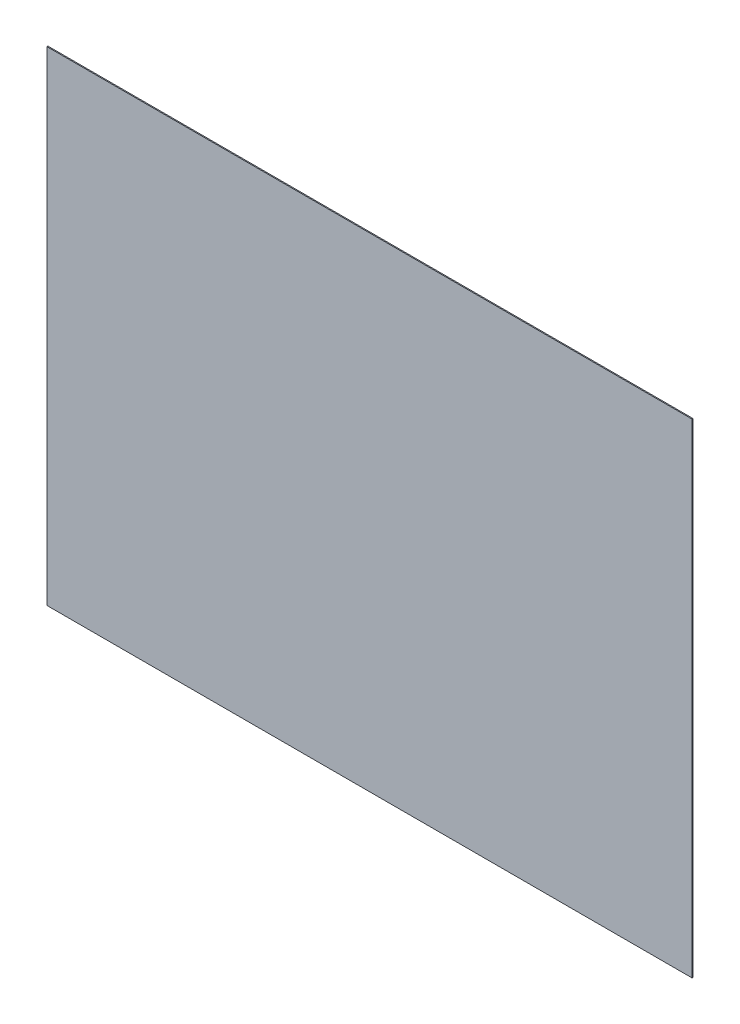
ISO-10303-21;
HEADER;
FILE_DESCRIPTION(('STEP AP214'),'2;1');
FILE_NAME('part.step','',(''),(''),'','','');
FILE_SCHEMA(('AUTOMOTIVE_DESIGN { 1 0 10303 214 1 1 1 1 }'));
ENDSEC;
DATA;
#1=APPLICATION_CONTEXT('core data for automotive mechanical design processes');
#2=APPLICATION_PROTOCOL_DEFINITION('international standard','automotive_design',2000,#1);
#3=PRODUCT_CONTEXT('',#1,'mechanical');
#4=PRODUCT('Part','Part','',(#3));
#5=PRODUCT_RELATED_PRODUCT_CATEGORY('part','',(#4));
#6=PRODUCT_DEFINITION_FORMATION('','',#4);
#7=PRODUCT_DEFINITION_CONTEXT('part definition',#1,'design');
#8=PRODUCT_DEFINITION('design','',#6,#7);
#9=PRODUCT_DEFINITION_SHAPE('','',#8);
#10=(LENGTH_UNIT() NAMED_UNIT(*) SI_UNIT(.MILLI.,.METRE.));
#11=(NAMED_UNIT(*) PLANE_ANGLE_UNIT() SI_UNIT($,.RADIAN.));
#12=(NAMED_UNIT(*) SI_UNIT($,.STERADIAN.) SOLID_ANGLE_UNIT());
#13=UNCERTAINTY_MEASURE_WITH_UNIT(LENGTH_MEASURE(1.E-05),#10,'distance_accuracy_value','');
#14=(GEOMETRIC_REPRESENTATION_CONTEXT(3) GLOBAL_UNCERTAINTY_ASSIGNED_CONTEXT((#13)) GLOBAL_UNIT_ASSIGNED_CONTEXT((#10,
#11,#12)) REPRESENTATION_CONTEXT('',''));
#15=CARTESIAN_POINT('',(0.,0.,0.));
#16=DIRECTION('',(0.,0.,1.));
#17=DIRECTION('',(1.,0.,0.));
#18=AXIS2_PLACEMENT_3D('',#15,#16,#17);
#19=CARTESIAN_POINT('',(32.4,-24.3,0.));
#20=DIRECTION('',(0.,0.,-1.));
#21=DIRECTION('',(-1.,0.,0.));
#22=AXIS2_PLACEMENT_3D('',#19,#20,#21);
#23=PLANE('',#22);
#24=DIRECTION('',(0.,1.,0.));
#25=VECTOR('',#24,1.);
#26=CARTESIAN_POINT('',(-32.4,24.3,0.));
#27=LINE('',#26,#25);
#28=CARTESIAN_POINT('',(-32.4,-24.3,0.));
#29=VERTEX_POINT('',#28);
#30=CARTESIAN_POINT('',(-32.4,24.3,0.));
#31=VERTEX_POINT('',#30);
#32=EDGE_CURVE('E54',#29,#31,#27,.T.);
#33=ORIENTED_EDGE('',*,*,#32,.T.);
#34=DIRECTION('',(1.,0.,0.));
#35=VECTOR('',#34,1.);
#36=CARTESIAN_POINT('',(32.4,24.3,0.));
#37=LINE('',#36,#35);
#38=CARTESIAN_POINT('',(32.4,24.3,0.));
#39=VERTEX_POINT('',#38);
#40=EDGE_CURVE('E75',#31,#39,#37,.T.);
#41=ORIENTED_EDGE('',*,*,#40,.T.);
#42=DIRECTION('',(0.,-1.,0.));
#43=VECTOR('',#42,1.);
#44=CARTESIAN_POINT('',(32.4,24.3,0.));
#45=LINE('',#44,#43);
#46=CARTESIAN_POINT('',(32.4,-24.3,0.));
#47=VERTEX_POINT('',#46);
#48=EDGE_CURVE('E57',#39,#47,#45,.T.);
#49=ORIENTED_EDGE('',*,*,#48,.T.);
#50=DIRECTION('',(-1.,0.,0.));
#51=VECTOR('',#50,1.);
#52=CARTESIAN_POINT('',(32.4,-24.3,0.));
#53=LINE('',#52,#51);
#54=EDGE_CURVE('E19',#47,#29,#53,.T.);
#55=ORIENTED_EDGE('',*,*,#54,.T.);
#56=EDGE_LOOP('',(#33,#41,#49,#55));
#57=FACE_BOUND('',#56,.T.);
#58=ADVANCED_FACE('F16',(#57),#23,.T.);
#59=CARTESIAN_POINT('',(32.4,-24.3,0.1));
#60=DIRECTION('',(0.,1.,0.));
#61=DIRECTION('',(-1.,0.,0.));
#62=AXIS2_PLACEMENT_3D('',#59,#60,#61);
#63=PLANE('',#62);
#64=DIRECTION('',(0.,0.,1.));
#65=VECTOR('',#64,1.);
#66=CARTESIAN_POINT('',(32.4,-24.3,0.1));
#67=LINE('',#66,#65);
#68=CARTESIAN_POINT('',(32.4,-24.3,0.1));
#69=VERTEX_POINT('',#68);
#70=EDGE_CURVE('E77',#47,#69,#67,.T.);
#71=ORIENTED_EDGE('',*,*,#70,.T.);
#72=DIRECTION('',(-1.,0.,0.));
#73=VECTOR('',#72,1.);
#74=CARTESIAN_POINT('',(32.4,-24.3,0.1));
#75=LINE('',#74,#73);
#76=CARTESIAN_POINT('',(-32.4,-24.3,0.1));
#77=VERTEX_POINT('',#76);
#78=EDGE_CURVE('E72',#69,#77,#75,.T.);
#79=ORIENTED_EDGE('',*,*,#78,.T.);
#80=DIRECTION('',(0.,0.,-1.));
#81=VECTOR('',#80,1.);
#82=CARTESIAN_POINT('',(-32.4,-24.3,0.1));
#83=LINE('',#82,#81);
#84=EDGE_CURVE('E62',#77,#29,#83,.T.);
#85=ORIENTED_EDGE('',*,*,#84,.T.);
#86=ORIENTED_EDGE('',*,*,#54,.F.);
#87=EDGE_LOOP('',(#71,#79,#85,#86));
#88=FACE_BOUND('',#87,.T.);
#89=ADVANCED_FACE('F71',(#88),#63,.F.);
#90=CARTESIAN_POINT('',(-32.4,24.3,0.1));
#91=DIRECTION('',(1.,0.,0.));
#92=DIRECTION('',(0.,0.,-1.));
#93=AXIS2_PLACEMENT_3D('',#90,#91,#92);
#94=PLANE('',#93);
#95=ORIENTED_EDGE('',*,*,#84,.F.);
#96=DIRECTION('',(0.,1.,0.));
#97=VECTOR('',#96,1.);
#98=CARTESIAN_POINT('',(-32.4,-24.3,0.1));
#99=LINE('',#98,#97);
#100=CARTESIAN_POINT('',(-32.4,24.3,0.1));
#101=VERTEX_POINT('',#100);
#102=EDGE_CURVE('E82',#77,#101,#99,.T.);
#103=ORIENTED_EDGE('',*,*,#102,.T.);
#104=DIRECTION('',(0.,0.,1.));
#105=VECTOR('',#104,1.);
#106=CARTESIAN_POINT('',(-32.4,24.3,0.1));
#107=LINE('',#106,#105);
#108=EDGE_CURVE('E68',#101,#31,#107,.F.);
#109=ORIENTED_EDGE('',*,*,#108,.T.);
#110=ORIENTED_EDGE('',*,*,#32,.F.);
#111=EDGE_LOOP('',(#95,#103,#109,#110));
#112=FACE_BOUND('',#111,.T.);
#113=ADVANCED_FACE('F65',(#112),#94,.F.);
#114=CARTESIAN_POINT('',(32.4,24.3,0.1));
#115=DIRECTION('',(0.,-1.,0.));
#116=DIRECTION('',(1.,0.,0.));
#117=AXIS2_PLACEMENT_3D('',#114,#115,#116);
#118=PLANE('',#117);
#119=ORIENTED_EDGE('',*,*,#108,.F.);
#120=DIRECTION('',(-1.,0.,0.));
#121=VECTOR('',#120,1.);
#122=CARTESIAN_POINT('',(32.4,24.3,0.1));
#123=LINE('',#122,#121);
#124=CARTESIAN_POINT('',(32.4,24.3,0.1));
#125=VERTEX_POINT('',#124);
#126=EDGE_CURVE('E25',#101,#125,#123,.F.);
#127=ORIENTED_EDGE('',*,*,#126,.T.);
#128=DIRECTION('',(0.,0.,1.));
#129=VECTOR('',#128,1.);
#130=CARTESIAN_POINT('',(32.4,24.3,0.1));
#131=LINE('',#130,#129);
#132=EDGE_CURVE('E33',#125,#39,#131,.F.);
#133=ORIENTED_EDGE('',*,*,#132,.T.);
#134=ORIENTED_EDGE('',*,*,#40,.F.);
#135=EDGE_LOOP('',(#119,#127,#133,#134));
#136=FACE_BOUND('',#135,.T.);
#137=ADVANCED_FACE('F87',(#136),#118,.F.);
#138=CARTESIAN_POINT('',(32.4,24.3,0.1));
#139=DIRECTION('',(-1.,0.,0.));
#140=DIRECTION('',(0.,-1.,0.));
#141=AXIS2_PLACEMENT_3D('',#138,#139,#140);
#142=PLANE('',#141);
#143=ORIENTED_EDGE('',*,*,#132,.F.);
#144=DIRECTION('',(0.,1.,0.));
#145=VECTOR('',#144,1.);
#146=CARTESIAN_POINT('',(32.4,-24.3,0.1));
#147=LINE('',#146,#145);
#148=EDGE_CURVE('E11',#125,#69,#147,.F.);
#149=ORIENTED_EDGE('',*,*,#148,.T.);
#150=ORIENTED_EDGE('',*,*,#70,.F.);
#151=ORIENTED_EDGE('',*,*,#48,.F.);
#152=EDGE_LOOP('',(#143,#149,#150,#151));
#153=FACE_BOUND('',#152,.T.);
#154=ADVANCED_FACE('F90',(#153),#142,.F.);
#155=CARTESIAN_POINT('',(32.4,-24.3,0.1));
#156=DIRECTION('',(0.,0.,-1.));
#157=DIRECTION('',(-1.,0.,0.));
#158=AXIS2_PLACEMENT_3D('',#155,#156,#157);
#159=PLANE('',#158);
#160=ORIENTED_EDGE('',*,*,#126,.F.);
#161=ORIENTED_EDGE('',*,*,#102,.F.);
#162=ORIENTED_EDGE('',*,*,#78,.F.);
#163=ORIENTED_EDGE('',*,*,#148,.F.);
#164=EDGE_LOOP('',(#160,#161,#162,#163));
#165=FACE_BOUND('',#164,.T.);
#166=ADVANCED_FACE('F89',(#165),#159,.F.);
#167=CLOSED_SHELL('',(#58,#89,#113,#137,#154,#166));
#168=MANIFOLD_SOLID_BREP('B1',#167);
#169=ADVANCED_BREP_SHAPE_REPRESENTATION('',(#18,#168),#14);
#170=SHAPE_DEFINITION_REPRESENTATION(#9,#169);
ENDSEC;
END-ISO-10303-21;
